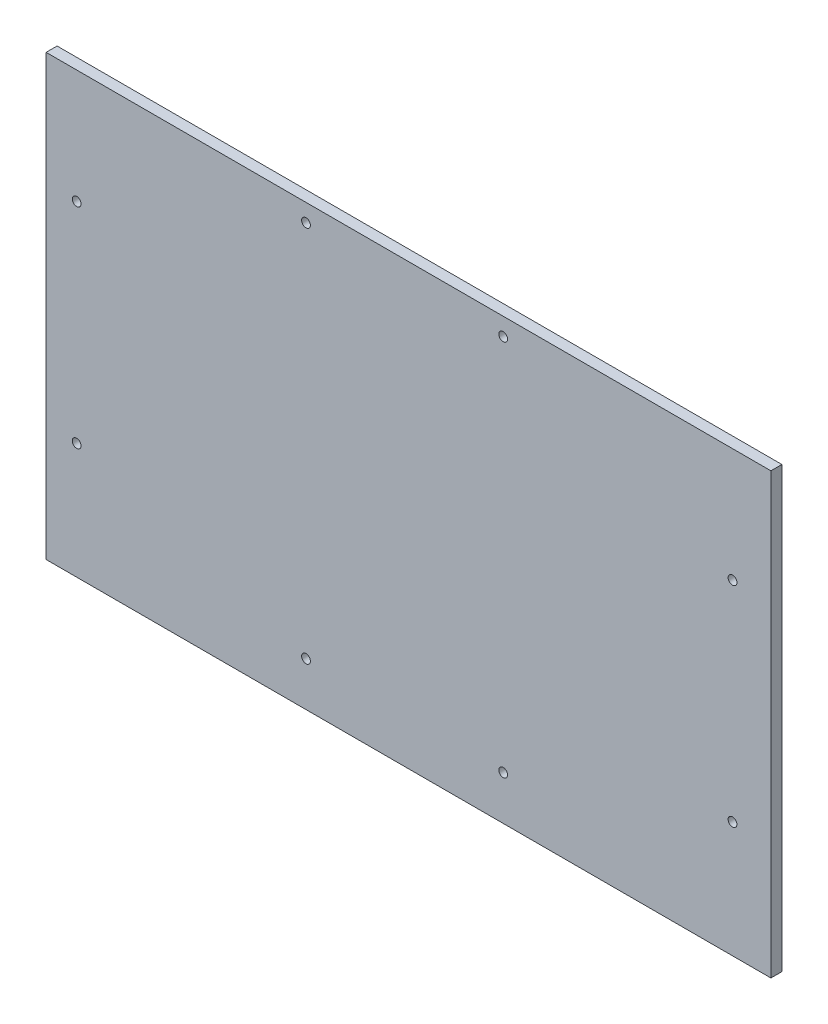
ISO-10303-21;
HEADER;
FILE_DESCRIPTION(('STEP AP214'),'2;1');
FILE_NAME('part.step','',(''),(''),'','','');
FILE_SCHEMA(('AUTOMOTIVE_DESIGN { 1 0 10303 214 1 1 1 1 }'));
ENDSEC;
DATA;
#1=APPLICATION_CONTEXT('core data for automotive mechanical design processes');
#2=APPLICATION_PROTOCOL_DEFINITION('international standard','automotive_design',2000,#1);
#3=PRODUCT_CONTEXT('',#1,'mechanical');
#4=PRODUCT('Part','Part','',(#3));
#5=PRODUCT_RELATED_PRODUCT_CATEGORY('part','',(#4));
#6=PRODUCT_DEFINITION_FORMATION('','',#4);
#7=PRODUCT_DEFINITION_CONTEXT('part definition',#1,'design');
#8=PRODUCT_DEFINITION('design','',#6,#7);
#9=PRODUCT_DEFINITION_SHAPE('','',#8);
#10=(LENGTH_UNIT() NAMED_UNIT(*) SI_UNIT(.MILLI.,.METRE.));
#11=(NAMED_UNIT(*) PLANE_ANGLE_UNIT() SI_UNIT($,.RADIAN.));
#12=(NAMED_UNIT(*) SI_UNIT($,.STERADIAN.) SOLID_ANGLE_UNIT());
#13=UNCERTAINTY_MEASURE_WITH_UNIT(LENGTH_MEASURE(1.E-05),#10,'distance_accuracy_value','');
#14=(GEOMETRIC_REPRESENTATION_CONTEXT(3) GLOBAL_UNCERTAINTY_ASSIGNED_CONTEXT((#13)) GLOBAL_UNIT_ASSIGNED_CONTEXT((#10,
#11,#12)) REPRESENTATION_CONTEXT('',''));
#15=CARTESIAN_POINT('',(0.,0.,0.));
#16=DIRECTION('',(0.,0.,1.));
#17=DIRECTION('',(1.,0.,0.));
#18=AXIS2_PLACEMENT_3D('',#15,#16,#17);
#19=CARTESIAN_POINT('',(340.898578828117,-172.636032504748,5.));
#20=DIRECTION('',(1.,0.,0.));
#21=DIRECTION('',(0.,0.,-1.));
#22=AXIS2_PLACEMENT_3D('',#19,#20,#21);
#23=PLANE('',#22);
#24=DIRECTION('',(0.,-1.,0.));
#25=VECTOR('',#24,1.);
#26=CARTESIAN_POINT('',(340.898578828117,-172.636032504748,0.));
#27=LINE('',#26,#25);
#28=CARTESIAN_POINT('',(340.898578828117,-172.636032504748,0.));
#29=VERTEX_POINT('',#28);
#30=CARTESIAN_POINT('',(340.898578828117,-372.636032504748,0.));
#31=VERTEX_POINT('',#30);
#32=EDGE_CURVE('E107',#29,#31,#27,.T.);
#33=ORIENTED_EDGE('',*,*,#32,.F.);
#34=DIRECTION('',(0.,0.,-1.));
#35=VECTOR('',#34,1.);
#36=CARTESIAN_POINT('',(340.898578828117,-172.636032504748,5.));
#37=LINE('',#36,#35);
#38=CARTESIAN_POINT('',(340.898578828117,-172.636032504748,5.));
#39=VERTEX_POINT('',#38);
#40=EDGE_CURVE('E11',#39,#29,#37,.T.);
#41=ORIENTED_EDGE('',*,*,#40,.F.);
#42=DIRECTION('',(0.,-1.,0.));
#43=VECTOR('',#42,1.);
#44=CARTESIAN_POINT('',(340.898578828117,-172.636032504748,5.));
#45=LINE('',#44,#43);
#46=CARTESIAN_POINT('',(340.898578828117,-372.636032504748,5.));
#47=VERTEX_POINT('',#46);
#48=EDGE_CURVE('E101',#39,#47,#45,.T.);
#49=ORIENTED_EDGE('',*,*,#48,.T.);
#50=DIRECTION('',(0.,0.,-1.));
#51=VECTOR('',#50,1.);
#52=CARTESIAN_POINT('',(340.898578828117,-372.636032504748,5.));
#53=LINE('',#52,#51);
#54=EDGE_CURVE('E80',#47,#31,#53,.T.);
#55=ORIENTED_EDGE('',*,*,#54,.T.);
#56=EDGE_LOOP('',(#33,#41,#49,#55));
#57=FACE_BOUND('',#56,.T.);
#58=ADVANCED_FACE('F39',(#57),#23,.T.);
#59=CARTESIAN_POINT('',(340.898578828117,-172.636032504748,5.));
#60=DIRECTION('',(0.,-1.,0.));
#61=DIRECTION('',(1.,0.,0.));
#62=AXIS2_PLACEMENT_3D('',#59,#60,#61);
#63=PLANE('',#62);
#64=DIRECTION('',(-1.,0.,0.));
#65=VECTOR('',#64,1.);
#66=CARTESIAN_POINT('',(340.898578828117,-172.636032504748,0.));
#67=LINE('',#66,#65);
#68=CARTESIAN_POINT('',(10.8985788281173,-172.636032504748,0.));
#69=VERTEX_POINT('',#68);
#70=EDGE_CURVE('E72',#29,#69,#67,.T.);
#71=ORIENTED_EDGE('',*,*,#70,.T.);
#72=DIRECTION('',(0.,0.,-1.));
#73=VECTOR('',#72,1.);
#74=CARTESIAN_POINT('',(10.8985788281173,-172.636032504748,5.));
#75=LINE('',#74,#73);
#76=CARTESIAN_POINT('',(10.8985788281173,-172.636032504748,5.));
#77=VERTEX_POINT('',#76);
#78=EDGE_CURVE('E48',#77,#69,#75,.T.);
#79=ORIENTED_EDGE('',*,*,#78,.F.);
#80=DIRECTION('',(-1.,0.,0.));
#81=VECTOR('',#80,1.);
#82=CARTESIAN_POINT('',(340.898578828117,-172.636032504748,5.));
#83=LINE('',#82,#81);
#84=EDGE_CURVE('E90',#39,#77,#83,.T.);
#85=ORIENTED_EDGE('',*,*,#84,.F.);
#86=ORIENTED_EDGE('',*,*,#40,.T.);
#87=EDGE_LOOP('',(#71,#79,#85,#86));
#88=FACE_BOUND('',#87,.T.);
#89=ADVANCED_FACE('F173',(#88),#63,.F.);
#90=CARTESIAN_POINT('',(10.8985788281173,-172.636032504748,5.));
#91=DIRECTION('',(1.,0.,0.));
#92=DIRECTION('',(0.,0.,-1.));
#93=AXIS2_PLACEMENT_3D('',#90,#91,#92);
#94=PLANE('',#93);
#95=DIRECTION('',(0.,-1.,0.));
#96=VECTOR('',#95,1.);
#97=CARTESIAN_POINT('',(10.8985788281173,-172.636032504748,0.));
#98=LINE('',#97,#96);
#99=CARTESIAN_POINT('',(10.8985788281173,-372.636032504748,0.));
#100=VERTEX_POINT('',#99);
#101=EDGE_CURVE('E97',#69,#100,#98,.T.);
#102=ORIENTED_EDGE('',*,*,#101,.T.);
#103=DIRECTION('',(0.,0.,-1.));
#104=VECTOR('',#103,1.);
#105=CARTESIAN_POINT('',(10.8985788281173,-372.636032504748,5.));
#106=LINE('',#105,#104);
#107=CARTESIAN_POINT('',(10.8985788281173,-372.636032504748,5.));
#108=VERTEX_POINT('',#107);
#109=EDGE_CURVE('E94',#108,#100,#106,.T.);
#110=ORIENTED_EDGE('',*,*,#109,.F.);
#111=DIRECTION('',(0.,-1.,0.));
#112=VECTOR('',#111,1.);
#113=CARTESIAN_POINT('',(10.8985788281173,-172.636032504748,5.));
#114=LINE('',#113,#112);
#115=EDGE_CURVE('E85',#77,#108,#114,.T.);
#116=ORIENTED_EDGE('',*,*,#115,.F.);
#117=ORIENTED_EDGE('',*,*,#78,.T.);
#118=EDGE_LOOP('',(#102,#110,#116,#117));
#119=FACE_BOUND('',#118,.T.);
#120=ADVANCED_FACE('F95',(#119),#94,.F.);
#121=CARTESIAN_POINT('',(340.898578828117,-372.636032504748,5.));
#122=DIRECTION('',(0.,-1.,0.));
#123=DIRECTION('',(1.,0.,0.));
#124=AXIS2_PLACEMENT_3D('',#121,#122,#123);
#125=PLANE('',#124);
#126=DIRECTION('',(-1.,0.,0.));
#127=VECTOR('',#126,1.);
#128=CARTESIAN_POINT('',(340.898578828117,-372.636032504748,0.));
#129=LINE('',#128,#127);
#130=EDGE_CURVE('E110',#31,#100,#129,.T.);
#131=ORIENTED_EDGE('',*,*,#130,.F.);
#132=ORIENTED_EDGE('',*,*,#54,.F.);
#133=DIRECTION('',(-1.,0.,0.));
#134=VECTOR('',#133,1.);
#135=CARTESIAN_POINT('',(340.898578828117,-372.636032504748,5.));
#136=LINE('',#135,#134);
#137=EDGE_CURVE('E89',#47,#108,#136,.T.);
#138=ORIENTED_EDGE('',*,*,#137,.T.);
#139=ORIENTED_EDGE('',*,*,#109,.T.);
#140=EDGE_LOOP('',(#131,#132,#138,#139));
#141=FACE_BOUND('',#140,.T.);
#142=ADVANCED_FACE('F100',(#141),#125,.T.);
#143=CARTESIAN_POINT('',(0.,0.,5.));
#144=DIRECTION('',(0.,0.,-1.));
#145=DIRECTION('',(-1.,0.,0.));
#146=AXIS2_PLACEMENT_3D('',#143,#144,#145);
#147=PLANE('',#146);
#148=CARTESIAN_POINT('',(24.8018873115851,-319.841869214863,5.));
#149=DIRECTION('',(0.,0.,-1.));
#150=DIRECTION('',(-1.,0.,0.));
#151=AXIS2_PLACEMENT_3D('',#148,#149,#150);
#152=CIRCLE('',#151,2.);
#153=CARTESIAN_POINT('',(22.8018873115851,-319.841869214863,5.));
#154=VERTEX_POINT('',#153);
#155=EDGE_CURVE('E111',#154,#154,#152,.F.);
#156=ORIENTED_EDGE('',*,*,#155,.F.);
#157=EDGE_LOOP('',(#156));
#158=FACE_BOUND('',#157,.T.);
#159=CARTESIAN_POINT('',(129.231353531866,-180.686460010489,5.));
#160=DIRECTION('',(0.,0.,-1.));
#161=DIRECTION('',(-1.,0.,0.));
#162=AXIS2_PLACEMENT_3D('',#159,#160,#161);
#163=CIRCLE('',#162,2.);
#164=CARTESIAN_POINT('',(127.231353531866,-180.686460010489,5.));
#165=VERTEX_POINT('',#164);
#166=EDGE_CURVE('E142',#165,#165,#163,.F.);
#167=ORIENTED_EDGE('',*,*,#166,.F.);
#168=EDGE_LOOP('',(#167));
#169=FACE_BOUND('',#168,.T.);
#170=CARTESIAN_POINT('',(129.231353531866,-352.554714054951,5.));
#171=DIRECTION('',(0.,0.,-1.));
#172=DIRECTION('',(-1.,0.,0.));
#173=AXIS2_PLACEMENT_3D('',#170,#171,#172);
#174=CIRCLE('',#173,2.);
#175=CARTESIAN_POINT('',(127.231353531866,-352.554714054951,5.));
#176=VERTEX_POINT('',#175);
#177=EDGE_CURVE('E139',#176,#176,#174,.F.);
#178=ORIENTED_EDGE('',*,*,#177,.F.);
#179=EDGE_LOOP('',(#178));
#180=FACE_BOUND('',#179,.T.);
#181=CARTESIAN_POINT('',(218.990638170507,-352.554714054951,5.));
#182=DIRECTION('',(0.,0.,-1.));
#183=DIRECTION('',(-1.,0.,0.));
#184=AXIS2_PLACEMENT_3D('',#181,#182,#183);
#185=CIRCLE('',#184,2.);
#186=CARTESIAN_POINT('',(216.990638170507,-352.554714054951,5.));
#187=VERTEX_POINT('',#186);
#188=EDGE_CURVE('E136',#187,#187,#185,.F.);
#189=ORIENTED_EDGE('',*,*,#188,.F.);
#190=EDGE_LOOP('',(#189));
#191=FACE_BOUND('',#190,.T.);
#192=CARTESIAN_POINT('',(323.420104390787,-319.841869214863,5.));
#193=DIRECTION('',(0.,0.,-1.));
#194=DIRECTION('',(-1.,0.,0.));
#195=AXIS2_PLACEMENT_3D('',#192,#193,#194);
#196=CIRCLE('',#195,1.99999999999994);
#197=CARTESIAN_POINT('',(321.420104390787,-319.841869214863,5.));
#198=VERTEX_POINT('',#197);
#199=EDGE_CURVE('E132',#198,#198,#196,.F.);
#200=ORIENTED_EDGE('',*,*,#199,.F.);
#201=EDGE_LOOP('',(#200));
#202=FACE_BOUND('',#201,.T.);
#203=CARTESIAN_POINT('',(323.420104390787,-224.471344642607,5.));
#204=DIRECTION('',(0.,0.,-1.));
#205=DIRECTION('',(-1.,0.,0.));
#206=AXIS2_PLACEMENT_3D('',#203,#204,#205);
#207=CIRCLE('',#206,2.);
#208=CARTESIAN_POINT('',(321.420104390787,-224.471344642607,5.));
#209=VERTEX_POINT('',#208);
#210=EDGE_CURVE('E128',#209,#209,#207,.F.);
#211=ORIENTED_EDGE('',*,*,#210,.F.);
#212=EDGE_LOOP('',(#211));
#213=FACE_BOUND('',#212,.T.);
#214=CARTESIAN_POINT('',(218.990638170507,-180.686460010489,5.));
#215=DIRECTION('',(0.,0.,-1.));
#216=DIRECTION('',(-1.,0.,0.));
#217=AXIS2_PLACEMENT_3D('',#214,#215,#216);
#218=CIRCLE('',#217,2.);
#219=CARTESIAN_POINT('',(216.990638170507,-180.686460010489,5.));
#220=VERTEX_POINT('',#219);
#221=EDGE_CURVE('E124',#220,#220,#218,.F.);
#222=ORIENTED_EDGE('',*,*,#221,.F.);
#223=EDGE_LOOP('',(#222));
#224=FACE_BOUND('',#223,.T.);
#225=CARTESIAN_POINT('',(24.8018873115851,-224.471344642607,5.));
#226=DIRECTION('',(0.,0.,-1.));
#227=DIRECTION('',(-1.,0.,0.));
#228=AXIS2_PLACEMENT_3D('',#225,#226,#227);
#229=CIRCLE('',#228,2.);
#230=CARTESIAN_POINT('',(22.8018873115851,-224.471344642607,5.));
#231=VERTEX_POINT('',#230);
#232=EDGE_CURVE('E120',#231,#231,#229,.F.);
#233=ORIENTED_EDGE('',*,*,#232,.F.);
#234=EDGE_LOOP('',(#233));
#235=FACE_BOUND('',#234,.T.);
#236=ORIENTED_EDGE('',*,*,#48,.F.);
#237=ORIENTED_EDGE('',*,*,#84,.T.);
#238=ORIENTED_EDGE('',*,*,#115,.T.);
#239=ORIENTED_EDGE('',*,*,#137,.F.);
#240=EDGE_LOOP('',(#236,#237,#238,#239));
#241=FACE_BOUND('',#240,.T.);
#242=ADVANCED_FACE('F88',(#158,#169,#180,#191,#202,#213,#224,#235,#241),#147,.F.);
#243=CARTESIAN_POINT('',(0.,0.,0.));
#244=DIRECTION('',(0.,0.,-1.));
#245=DIRECTION('',(-1.,0.,0.));
#246=AXIS2_PLACEMENT_3D('',#243,#244,#245);
#247=PLANE('',#246);
#248=CARTESIAN_POINT('',(24.8018873115851,-319.841869214863,0.));
#249=DIRECTION('',(0.,0.,-1.));
#250=DIRECTION('',(-1.,0.,0.));
#251=AXIS2_PLACEMENT_3D('',#248,#249,#250);
#252=CIRCLE('',#251,2.);
#253=CARTESIAN_POINT('',(22.8018873115851,-319.841869214863,0.));
#254=VERTEX_POINT('',#253);
#255=EDGE_CURVE('E42',#254,#254,#252,.F.);
#256=ORIENTED_EDGE('',*,*,#255,.T.);
#257=EDGE_LOOP('',(#256));
#258=FACE_BOUND('',#257,.T.);
#259=CARTESIAN_POINT('',(129.231353531866,-180.686460010489,0.));
#260=DIRECTION('',(0.,0.,-1.));
#261=DIRECTION('',(-1.,0.,0.));
#262=AXIS2_PLACEMENT_3D('',#259,#260,#261);
#263=CIRCLE('',#262,2.);
#264=CARTESIAN_POINT('',(127.231353531866,-180.686460010489,0.));
#265=VERTEX_POINT('',#264);
#266=EDGE_CURVE('E140',#265,#265,#263,.F.);
#267=ORIENTED_EDGE('',*,*,#266,.T.);
#268=EDGE_LOOP('',(#267));
#269=FACE_BOUND('',#268,.T.);
#270=CARTESIAN_POINT('',(129.231353531866,-352.554714054951,0.));
#271=DIRECTION('',(0.,0.,-1.));
#272=DIRECTION('',(-1.,0.,0.));
#273=AXIS2_PLACEMENT_3D('',#270,#271,#272);
#274=CIRCLE('',#273,2.);
#275=CARTESIAN_POINT('',(127.231353531866,-352.554714054951,0.));
#276=VERTEX_POINT('',#275);
#277=EDGE_CURVE('E137',#276,#276,#274,.F.);
#278=ORIENTED_EDGE('',*,*,#277,.T.);
#279=EDGE_LOOP('',(#278));
#280=FACE_BOUND('',#279,.T.);
#281=CARTESIAN_POINT('',(218.990638170507,-352.554714054951,0.));
#282=DIRECTION('',(0.,0.,-1.));
#283=DIRECTION('',(-1.,0.,0.));
#284=AXIS2_PLACEMENT_3D('',#281,#282,#283);
#285=CIRCLE('',#284,2.);
#286=CARTESIAN_POINT('',(216.990638170507,-352.554714054951,0.));
#287=VERTEX_POINT('',#286);
#288=EDGE_CURVE('E133',#287,#287,#285,.F.);
#289=ORIENTED_EDGE('',*,*,#288,.T.);
#290=EDGE_LOOP('',(#289));
#291=FACE_BOUND('',#290,.T.);
#292=CARTESIAN_POINT('',(323.420104390787,-319.841869214863,0.));
#293=DIRECTION('',(0.,0.,-1.));
#294=DIRECTION('',(-1.,0.,0.));
#295=AXIS2_PLACEMENT_3D('',#292,#293,#294);
#296=CIRCLE('',#295,1.99999999999994);
#297=CARTESIAN_POINT('',(321.420104390787,-319.841869214863,0.));
#298=VERTEX_POINT('',#297);
#299=EDGE_CURVE('E129',#298,#298,#296,.F.);
#300=ORIENTED_EDGE('',*,*,#299,.T.);
#301=EDGE_LOOP('',(#300));
#302=FACE_BOUND('',#301,.T.);
#303=CARTESIAN_POINT('',(323.420104390787,-224.471344642607,0.));
#304=DIRECTION('',(0.,0.,-1.));
#305=DIRECTION('',(-1.,0.,0.));
#306=AXIS2_PLACEMENT_3D('',#303,#304,#305);
#307=CIRCLE('',#306,2.);
#308=CARTESIAN_POINT('',(321.420104390787,-224.471344642607,0.));
#309=VERTEX_POINT('',#308);
#310=EDGE_CURVE('E125',#309,#309,#307,.F.);
#311=ORIENTED_EDGE('',*,*,#310,.T.);
#312=EDGE_LOOP('',(#311));
#313=FACE_BOUND('',#312,.T.);
#314=CARTESIAN_POINT('',(218.990638170507,-180.686460010489,0.));
#315=DIRECTION('',(0.,0.,-1.));
#316=DIRECTION('',(-1.,0.,0.));
#317=AXIS2_PLACEMENT_3D('',#314,#315,#316);
#318=CIRCLE('',#317,2.);
#319=CARTESIAN_POINT('',(216.990638170507,-180.686460010489,0.));
#320=VERTEX_POINT('',#319);
#321=EDGE_CURVE('E121',#320,#320,#318,.F.);
#322=ORIENTED_EDGE('',*,*,#321,.T.);
#323=EDGE_LOOP('',(#322));
#324=FACE_BOUND('',#323,.T.);
#325=CARTESIAN_POINT('',(24.8018873115851,-224.471344642607,0.));
#326=DIRECTION('',(0.,0.,-1.));
#327=DIRECTION('',(-1.,0.,0.));
#328=AXIS2_PLACEMENT_3D('',#325,#326,#327);
#329=CIRCLE('',#328,2.);
#330=CARTESIAN_POINT('',(22.8018873115851,-224.471344642607,0.));
#331=VERTEX_POINT('',#330);
#332=EDGE_CURVE('E117',#331,#331,#329,.F.);
#333=ORIENTED_EDGE('',*,*,#332,.T.);
#334=EDGE_LOOP('',(#333));
#335=FACE_BOUND('',#334,.T.);
#336=ORIENTED_EDGE('',*,*,#32,.T.);
#337=ORIENTED_EDGE('',*,*,#130,.T.);
#338=ORIENTED_EDGE('',*,*,#101,.F.);
#339=ORIENTED_EDGE('',*,*,#70,.F.);
#340=EDGE_LOOP('',(#336,#337,#338,#339));
#341=FACE_BOUND('',#340,.T.);
#342=ADVANCED_FACE('F159',(#258,#269,#280,#291,#302,#313,#324,#335,#341),#247,.T.);
#343=CARTESIAN_POINT('',(24.8018873115851,-224.471344642607,115.));
#344=DIRECTION('',(0.,0.,-1.));
#345=DIRECTION('',(-1.,0.,0.));
#346=AXIS2_PLACEMENT_3D('',#343,#344,#345);
#347=CYLINDRICAL_SURFACE('',#346,2.);
#348=ORIENTED_EDGE('',*,*,#332,.F.);
#349=EDGE_LOOP('',(#348));
#350=FACE_BOUND('',#349,.T.);
#351=ORIENTED_EDGE('',*,*,#232,.T.);
#352=EDGE_LOOP('',(#351));
#353=FACE_BOUND('',#352,.T.);
#354=ADVANCED_FACE('F180',(#350,#353),#347,.F.);
#355=CARTESIAN_POINT('',(218.990638170507,-180.686460010489,115.));
#356=DIRECTION('',(0.,0.,-1.));
#357=DIRECTION('',(-1.,0.,0.));
#358=AXIS2_PLACEMENT_3D('',#355,#356,#357);
#359=CYLINDRICAL_SURFACE('',#358,2.);
#360=ORIENTED_EDGE('',*,*,#321,.F.);
#361=EDGE_LOOP('',(#360));
#362=FACE_BOUND('',#361,.T.);
#363=ORIENTED_EDGE('',*,*,#221,.T.);
#364=EDGE_LOOP('',(#363));
#365=FACE_BOUND('',#364,.T.);
#366=ADVANCED_FACE('F186',(#362,#365),#359,.F.);
#367=CARTESIAN_POINT('',(323.420104390787,-224.471344642607,115.));
#368=DIRECTION('',(0.,0.,-1.));
#369=DIRECTION('',(-1.,0.,0.));
#370=AXIS2_PLACEMENT_3D('',#367,#368,#369);
#371=CYLINDRICAL_SURFACE('',#370,2.);
#372=ORIENTED_EDGE('',*,*,#310,.F.);
#373=EDGE_LOOP('',(#372));
#374=FACE_BOUND('',#373,.T.);
#375=ORIENTED_EDGE('',*,*,#210,.T.);
#376=EDGE_LOOP('',(#375));
#377=FACE_BOUND('',#376,.T.);
#378=ADVANCED_FACE('F221',(#374,#377),#371,.F.);
#379=CARTESIAN_POINT('',(323.420104390787,-319.841869214863,115.));
#380=DIRECTION('',(0.,0.,-1.));
#381=DIRECTION('',(-1.,0.,0.));
#382=AXIS2_PLACEMENT_3D('',#379,#380,#381);
#383=CYLINDRICAL_SURFACE('',#382,1.99999999999994);
#384=ORIENTED_EDGE('',*,*,#299,.F.);
#385=EDGE_LOOP('',(#384));
#386=FACE_BOUND('',#385,.T.);
#387=ORIENTED_EDGE('',*,*,#199,.T.);
#388=EDGE_LOOP('',(#387));
#389=FACE_BOUND('',#388,.T.);
#390=ADVANCED_FACE('F230',(#386,#389),#383,.F.);
#391=CARTESIAN_POINT('',(218.990638170507,-352.554714054951,115.));
#392=DIRECTION('',(0.,0.,-1.));
#393=DIRECTION('',(-1.,0.,0.));
#394=AXIS2_PLACEMENT_3D('',#391,#392,#393);
#395=CYLINDRICAL_SURFACE('',#394,2.);
#396=ORIENTED_EDGE('',*,*,#288,.F.);
#397=EDGE_LOOP('',(#396));
#398=FACE_BOUND('',#397,.T.);
#399=ORIENTED_EDGE('',*,*,#188,.T.);
#400=EDGE_LOOP('',(#399));
#401=FACE_BOUND('',#400,.T.);
#402=ADVANCED_FACE('F240',(#398,#401),#395,.F.);
#403=CARTESIAN_POINT('',(129.231353531866,-352.554714054951,115.));
#404=DIRECTION('',(0.,0.,-1.));
#405=DIRECTION('',(-1.,0.,0.));
#406=AXIS2_PLACEMENT_3D('',#403,#404,#405);
#407=CYLINDRICAL_SURFACE('',#406,2.);
#408=ORIENTED_EDGE('',*,*,#277,.F.);
#409=EDGE_LOOP('',(#408));
#410=FACE_BOUND('',#409,.T.);
#411=ORIENTED_EDGE('',*,*,#177,.T.);
#412=EDGE_LOOP('',(#411));
#413=FACE_BOUND('',#412,.T.);
#414=ADVANCED_FACE('F168',(#410,#413),#407,.F.);
#415=CARTESIAN_POINT('',(129.231353531866,-180.686460010489,115.));
#416=DIRECTION('',(0.,0.,-1.));
#417=DIRECTION('',(-1.,0.,0.));
#418=AXIS2_PLACEMENT_3D('',#415,#416,#417);
#419=CYLINDRICAL_SURFACE('',#418,2.);
#420=ORIENTED_EDGE('',*,*,#266,.F.);
#421=EDGE_LOOP('',(#420));
#422=FACE_BOUND('',#421,.T.);
#423=ORIENTED_EDGE('',*,*,#166,.T.);
#424=EDGE_LOOP('',(#423));
#425=FACE_BOUND('',#424,.T.);
#426=ADVANCED_FACE('F163',(#422,#425),#419,.F.);
#427=CARTESIAN_POINT('',(24.8018873115851,-319.841869214863,115.));
#428=DIRECTION('',(0.,0.,-1.));
#429=DIRECTION('',(-1.,0.,0.));
#430=AXIS2_PLACEMENT_3D('',#427,#428,#429);
#431=CYLINDRICAL_SURFACE('',#430,2.);
#432=ORIENTED_EDGE('',*,*,#255,.F.);
#433=EDGE_LOOP('',(#432));
#434=FACE_BOUND('',#433,.T.);
#435=ORIENTED_EDGE('',*,*,#155,.T.);
#436=EDGE_LOOP('',(#435));
#437=FACE_BOUND('',#436,.T.);
#438=ADVANCED_FACE('F161',(#434,#437),#431,.F.);
#439=CLOSED_SHELL('',(#58,#89,#120,#142,#242,#342,#354,#366,#378,#390,#402,#414,#426,#438));
#440=MANIFOLD_SOLID_BREP('B2',#439);
#441=ADVANCED_BREP_SHAPE_REPRESENTATION('',(#18,#440),#14);
#442=SHAPE_DEFINITION_REPRESENTATION(#9,#441);
ENDSEC;
END-ISO-10303-21;
